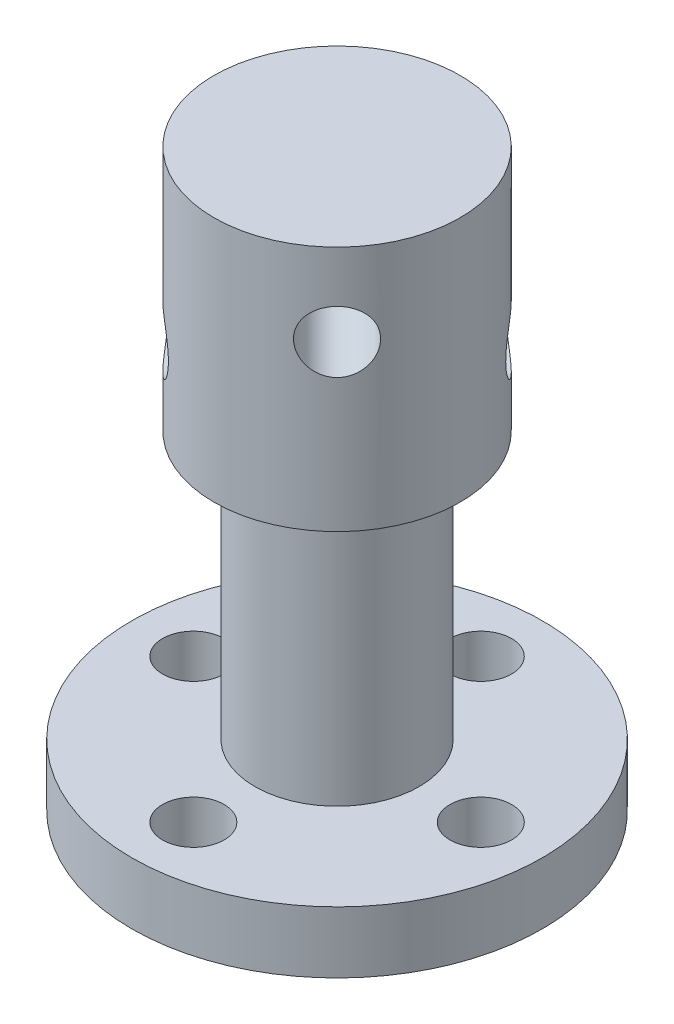
ISO-10303-21;
HEADER;
FILE_DESCRIPTION(('STEP AP214'),'2;1');
FILE_NAME('part.step','',(''),(''),'','','');
FILE_SCHEMA(('AUTOMOTIVE_DESIGN { 1 0 10303 214 1 1 1 1 }'));
ENDSEC;
DATA;
#1=APPLICATION_CONTEXT('core data for automotive mechanical design processes');
#2=APPLICATION_PROTOCOL_DEFINITION('international standard','automotive_design',2000,#1);
#3=PRODUCT_CONTEXT('',#1,'mechanical');
#4=PRODUCT('Part','Part','',(#3));
#5=PRODUCT_RELATED_PRODUCT_CATEGORY('part','',(#4));
#6=PRODUCT_DEFINITION_FORMATION('','',#4);
#7=PRODUCT_DEFINITION_CONTEXT('part definition',#1,'design');
#8=PRODUCT_DEFINITION('design','',#6,#7);
#9=PRODUCT_DEFINITION_SHAPE('','',#8);
#10=(LENGTH_UNIT() NAMED_UNIT(*) SI_UNIT(.MILLI.,.METRE.));
#11=(NAMED_UNIT(*) PLANE_ANGLE_UNIT() SI_UNIT($,.RADIAN.));
#12=(NAMED_UNIT(*) SI_UNIT($,.STERADIAN.) SOLID_ANGLE_UNIT());
#13=UNCERTAINTY_MEASURE_WITH_UNIT(LENGTH_MEASURE(1.E-05),#10,'distance_accuracy_value','');
#14=(GEOMETRIC_REPRESENTATION_CONTEXT(3) GLOBAL_UNCERTAINTY_ASSIGNED_CONTEXT((#13)) GLOBAL_UNIT_ASSIGNED_CONTEXT((#10,
#11,#12)) REPRESENTATION_CONTEXT('',''));
#15=CARTESIAN_POINT('',(0.,0.,0.));
#16=DIRECTION('',(0.,0.,1.));
#17=DIRECTION('',(1.,0.,0.));
#18=AXIS2_PLACEMENT_3D('',#15,#16,#17);
#19=CARTESIAN_POINT('',(0.,3.,0.));
#20=DIRECTION('',(0.,1.,0.));
#21=DIRECTION('',(0.,0.,1.));
#22=AXIS2_PLACEMENT_3D('',#19,#20,#21);
#23=PLANE('',#22);
#24=CARTESIAN_POINT('',(0.,3.,0.));
#25=DIRECTION('',(0.,1.,0.));
#26=DIRECTION('',(0.,0.,1.));
#27=AXIS2_PLACEMENT_3D('',#24,#25,#26);
#28=CIRCLE('',#27,4.);
#29=CARTESIAN_POINT('',(0.,3.,4.));
#30=VERTEX_POINT('',#29);
#31=EDGE_CURVE('E129',#30,#30,#28,.F.);
#32=ORIENTED_EDGE('',*,*,#31,.T.);
#33=EDGE_LOOP('',(#32));
#34=FACE_BOUND('',#33,.T.);
#35=CARTESIAN_POINT('',(3.95332173747447E-13,3.,7.));
#36=DIRECTION('',(0.,1.,0.));
#37=DIRECTION('',(0.,0.,1.));
#38=AXIS2_PLACEMENT_3D('',#35,#36,#37);
#39=CIRCLE('',#38,1.50000000000042);
#40=CARTESIAN_POINT('',(3.95332173747447E-13,3.,8.50000000000043));
#41=VERTEX_POINT('',#40);
#42=EDGE_CURVE('E147',#41,#41,#39,.T.);
#43=ORIENTED_EDGE('',*,*,#42,.F.);
#44=EDGE_LOOP('',(#43));
#45=FACE_BOUND('',#44,.T.);
#46=CARTESIAN_POINT('',(0.,3.,-7.));
#47=DIRECTION('',(0.,1.,0.));
#48=DIRECTION('',(0.,0.,1.));
#49=AXIS2_PLACEMENT_3D('',#46,#47,#48);
#50=CIRCLE('',#49,1.5);
#51=CARTESIAN_POINT('',(0.,3.,-5.5));
#52=VERTEX_POINT('',#51);
#53=EDGE_CURVE('E55',#52,#52,#50,.T.);
#54=ORIENTED_EDGE('',*,*,#53,.F.);
#55=EDGE_LOOP('',(#54));
#56=FACE_BOUND('',#55,.T.);
#57=CARTESIAN_POINT('',(0.,3.,0.));
#58=DIRECTION('',(0.,1.,0.));
#59=DIRECTION('',(0.,0.,1.));
#60=AXIS2_PLACEMENT_3D('',#57,#58,#59);
#61=CIRCLE('',#60,10.);
#62=CARTESIAN_POINT('',(0.,3.,10.));
#63=VERTEX_POINT('',#62);
#64=EDGE_CURVE('E10',#63,#63,#61,.T.);
#65=ORIENTED_EDGE('',*,*,#64,.T.);
#66=EDGE_LOOP('',(#65));
#67=FACE_BOUND('',#66,.T.);
#68=CARTESIAN_POINT('',(7.0000000000002,3.,-1.97666086873723E-13));
#69=DIRECTION('',(0.,1.,0.));
#70=DIRECTION('',(0.,0.,1.));
#71=AXIS2_PLACEMENT_3D('',#68,#69,#70);
#72=CIRCLE('',#71,1.50000000000015);
#73=CARTESIAN_POINT('',(7.0000000000002,3.,1.49999999999996));
#74=VERTEX_POINT('',#73);
#75=EDGE_CURVE('E153',#74,#74,#72,.T.);
#76=ORIENTED_EDGE('',*,*,#75,.F.);
#77=EDGE_LOOP('',(#76));
#78=FACE_BOUND('',#77,.T.);
#79=CARTESIAN_POINT('',(-6.9999999999998,3.,1.98523339633126E-13));
#80=DIRECTION('',(0.,1.,0.));
#81=DIRECTION('',(0.,0.,1.));
#82=AXIS2_PLACEMENT_3D('',#79,#80,#81);
#83=CIRCLE('',#82,1.50000000000032);
#84=CARTESIAN_POINT('',(-6.9999999999998,3.,1.50000000000052));
#85=VERTEX_POINT('',#84);
#86=EDGE_CURVE('E141',#85,#85,#83,.T.);
#87=ORIENTED_EDGE('',*,*,#86,.F.);
#88=EDGE_LOOP('',(#87));
#89=FACE_BOUND('',#88,.T.);
#90=ADVANCED_FACE('F37',(#34,#45,#56,#67,#78,#89),#23,.T.);
#91=CARTESIAN_POINT('',(0.,0.,0.));
#92=DIRECTION('',(0.,1.,0.));
#93=DIRECTION('',(0.,0.,1.));
#94=AXIS2_PLACEMENT_3D('',#91,#92,#93);
#95=PLANE('',#94);
#96=CARTESIAN_POINT('',(0.,0.,0.));
#97=DIRECTION('',(0.,1.,0.));
#98=DIRECTION('',(0.,0.,1.));
#99=AXIS2_PLACEMENT_3D('',#96,#97,#98);
#100=CIRCLE('',#99,10.);
#101=CARTESIAN_POINT('',(0.,0.,10.));
#102=VERTEX_POINT('',#101);
#103=EDGE_CURVE('E50',#102,#102,#100,.T.);
#104=ORIENTED_EDGE('',*,*,#103,.F.);
#105=EDGE_LOOP('',(#104));
#106=FACE_BOUND('',#105,.T.);
#107=CARTESIAN_POINT('',(0.,0.,-7.));
#108=DIRECTION('',(0.,1.,0.));
#109=DIRECTION('',(0.,0.,1.));
#110=AXIS2_PLACEMENT_3D('',#107,#108,#109);
#111=CIRCLE('',#110,1.5);
#112=CARTESIAN_POINT('',(0.,0.,-5.5));
#113=VERTEX_POINT('',#112);
#114=EDGE_CURVE('E58',#113,#113,#111,.T.);
#115=ORIENTED_EDGE('',*,*,#114,.T.);
#116=EDGE_LOOP('',(#115));
#117=FACE_BOUND('',#116,.T.);
#118=CARTESIAN_POINT('',(7.0000000000002,0.,-1.97666086873723E-13));
#119=DIRECTION('',(0.,1.,0.));
#120=DIRECTION('',(0.,0.,1.));
#121=AXIS2_PLACEMENT_3D('',#118,#119,#120);
#122=CIRCLE('',#121,1.50000000000015);
#123=CARTESIAN_POINT('',(7.0000000000002,0.,1.49999999999996));
#124=VERTEX_POINT('',#123);
#125=EDGE_CURVE('E150',#124,#124,#122,.T.);
#126=ORIENTED_EDGE('',*,*,#125,.T.);
#127=EDGE_LOOP('',(#126));
#128=FACE_BOUND('',#127,.T.);
#129=CARTESIAN_POINT('',(3.95332173747447E-13,0.,7.));
#130=DIRECTION('',(0.,1.,0.));
#131=DIRECTION('',(0.,0.,1.));
#132=AXIS2_PLACEMENT_3D('',#129,#130,#131);
#133=CIRCLE('',#132,1.50000000000042);
#134=CARTESIAN_POINT('',(3.95332173747447E-13,0.,8.50000000000043));
#135=VERTEX_POINT('',#134);
#136=EDGE_CURVE('E144',#135,#135,#133,.T.);
#137=ORIENTED_EDGE('',*,*,#136,.T.);
#138=EDGE_LOOP('',(#137));
#139=FACE_BOUND('',#138,.T.);
#140=CARTESIAN_POINT('',(-6.9999999999998,0.,1.98523339633126E-13));
#141=DIRECTION('',(0.,1.,0.));
#142=DIRECTION('',(0.,0.,1.));
#143=AXIS2_PLACEMENT_3D('',#140,#141,#142);
#144=CIRCLE('',#143,1.50000000000032);
#145=CARTESIAN_POINT('',(-6.9999999999998,0.,1.50000000000052));
#146=VERTEX_POINT('',#145);
#147=EDGE_CURVE('E134',#146,#146,#144,.T.);
#148=ORIENTED_EDGE('',*,*,#147,.T.);
#149=EDGE_LOOP('',(#148));
#150=FACE_BOUND('',#149,.T.);
#151=ADVANCED_FACE('F95',(#106,#117,#128,#139,#150),#95,.F.);
#152=CARTESIAN_POINT('',(0.,3.,0.));
#153=DIRECTION('',(0.,-1.,0.));
#154=DIRECTION('',(0.,0.,-1.));
#155=AXIS2_PLACEMENT_3D('',#152,#153,#154);
#156=CYLINDRICAL_SURFACE('',#155,10.);
#157=ORIENTED_EDGE('',*,*,#64,.F.);
#158=EDGE_LOOP('',(#157));
#159=FACE_BOUND('',#158,.T.);
#160=ORIENTED_EDGE('',*,*,#103,.T.);
#161=EDGE_LOOP('',(#160));
#162=FACE_BOUND('',#161,.T.);
#163=ADVANCED_FACE('F39',(#159,#162),#156,.T.);
#164=CARTESIAN_POINT('',(0.,3.,-7.));
#165=DIRECTION('',(0.,-1.,0.));
#166=DIRECTION('',(0.,0.,-1.));
#167=AXIS2_PLACEMENT_3D('',#164,#165,#166);
#168=CYLINDRICAL_SURFACE('',#167,1.5);
#169=ORIENTED_EDGE('',*,*,#53,.T.);
#170=EDGE_LOOP('',(#169));
#171=FACE_BOUND('',#170,.T.);
#172=ORIENTED_EDGE('',*,*,#114,.F.);
#173=EDGE_LOOP('',(#172));
#174=FACE_BOUND('',#173,.T.);
#175=ADVANCED_FACE('F105',(#171,#174),#168,.F.);
#176=CARTESIAN_POINT('',(7.0000000000002,3.,-1.97666086873723E-13));
#177=DIRECTION('',(0.,-1.,0.));
#178=DIRECTION('',(0.,0.,-1.));
#179=AXIS2_PLACEMENT_3D('',#176,#177,#178);
#180=CYLINDRICAL_SURFACE('',#179,1.50000000000015);
#181=ORIENTED_EDGE('',*,*,#75,.T.);
#182=EDGE_LOOP('',(#181));
#183=FACE_BOUND('',#182,.T.);
#184=ORIENTED_EDGE('',*,*,#125,.F.);
#185=EDGE_LOOP('',(#184));
#186=FACE_BOUND('',#185,.T.);
#187=ADVANCED_FACE('F108',(#183,#186),#180,.F.);
#188=CARTESIAN_POINT('',(3.95332173747447E-13,3.,7.));
#189=DIRECTION('',(0.,-1.,0.));
#190=DIRECTION('',(0.,0.,-1.));
#191=AXIS2_PLACEMENT_3D('',#188,#189,#190);
#192=CYLINDRICAL_SURFACE('',#191,1.50000000000042);
#193=ORIENTED_EDGE('',*,*,#42,.T.);
#194=EDGE_LOOP('',(#193));
#195=FACE_BOUND('',#194,.T.);
#196=ORIENTED_EDGE('',*,*,#136,.F.);
#197=EDGE_LOOP('',(#196));
#198=FACE_BOUND('',#197,.T.);
#199=ADVANCED_FACE('F112',(#195,#198),#192,.F.);
#200=CARTESIAN_POINT('',(-6.9999999999998,3.,1.98523339633126E-13));
#201=DIRECTION('',(0.,-1.,0.));
#202=DIRECTION('',(0.,0.,-1.));
#203=AXIS2_PLACEMENT_3D('',#200,#201,#202);
#204=CYLINDRICAL_SURFACE('',#203,1.50000000000032);
#205=ORIENTED_EDGE('',*,*,#86,.T.);
#206=EDGE_LOOP('',(#205));
#207=FACE_BOUND('',#206,.T.);
#208=ORIENTED_EDGE('',*,*,#147,.F.);
#209=EDGE_LOOP('',(#208));
#210=FACE_BOUND('',#209,.T.);
#211=ADVANCED_FACE('F116',(#207,#210),#204,.F.);
#212=CARTESIAN_POINT('',(0.,16.,0.));
#213=DIRECTION('',(0.,-1.,0.));
#214=DIRECTION('',(0.,0.,-1.));
#215=AXIS2_PLACEMENT_3D('',#212,#213,#214);
#216=CYLINDRICAL_SURFACE('',#215,4.);
#217=ORIENTED_EDGE('',*,*,#31,.F.);
#218=EDGE_LOOP('',(#217));
#219=FACE_BOUND('',#218,.T.);
#220=CARTESIAN_POINT('',(0.,16.,0.));
#221=DIRECTION('',(0.,1.,0.));
#222=DIRECTION('',(0.,0.,1.));
#223=AXIS2_PLACEMENT_3D('',#220,#221,#222);
#224=CIRCLE('',#223,4.);
#225=CARTESIAN_POINT('',(0.,16.,4.));
#226=VERTEX_POINT('',#225);
#227=EDGE_CURVE('E131',#226,#226,#224,.T.);
#228=ORIENTED_EDGE('',*,*,#227,.F.);
#229=EDGE_LOOP('',(#228));
#230=FACE_BOUND('',#229,.T.);
#231=ADVANCED_FACE('F119',(#219,#230),#216,.T.);
#232=CARTESIAN_POINT('',(0.,28.,0.));
#233=DIRECTION('',(0.,-1.,0.));
#234=DIRECTION('',(0.,0.,-1.));
#235=AXIS2_PLACEMENT_3D('',#232,#233,#234);
#236=CYLINDRICAL_SURFACE('',#235,6.);
#237=CARTESIAN_POINT('',(3.04725900950897,24.,5.16857935306854));
#238=CARTESIAN_POINT('',(3.04726179129933,24.0828304505548,5.16857880743369));
#239=CARTESIAN_POINT('',(3.05339320996128,24.1656869392068,5.16497774998342));
#240=CARTESIAN_POINT('',(3.07760964290118,24.3290205469044,5.15058350523461));
#241=CARTESIAN_POINT('',(3.09570161407534,24.409496252681,5.13978613214468));
#242=CARTESIAN_POINT('',(3.14290411721005,24.5656821229122,5.11105766460471));
#243=CARTESIAN_POINT('',(3.17200042396876,24.6413982932314,5.09313577842416));
#244=CARTESIAN_POINT('',(3.23987592066896,24.786186511524,5.05022864081786));
#245=CARTESIAN_POINT('',(3.27865552169794,24.8552582772481,5.02524308951048));
#246=CARTESIAN_POINT('',(3.36513477763629,24.9863169871573,4.9677570215999));
#247=CARTESIAN_POINT('',(3.41299615668828,25.04813616021,4.93511722985393));
#248=CARTESIAN_POINT('',(3.51521732424168,25.1614568366162,4.86283449298292));
#249=CARTESIAN_POINT('',(3.56957771952014,25.212957375373,4.82319089378593));
#250=CARTESIAN_POINT('',(3.68357050948847,25.3048652805788,4.73671713523249));
#251=CARTESIAN_POINT('',(3.7432658825612,25.3451078328969,4.68979441760639));
#252=CARTESIAN_POINT('',(3.86506473025767,25.4122857864919,4.58993107889531));
#253=CARTESIAN_POINT('',(3.92716784812289,25.4392231511493,4.5369913471304));
#254=CARTESIAN_POINT('',(4.05031704562701,25.4784887007472,4.42736795554058));
#255=CARTESIAN_POINT('',(4.11135905215045,25.491101786596,4.37078186721879));
#256=CARTESIAN_POINT('',(4.23165526926786,25.5022550275653,4.2544202773061));
#257=CARTESIAN_POINT('',(4.29090974288238,25.5007972633258,4.19464524855994));
#258=CARTESIAN_POINT('',(4.40460840301042,25.4840550898499,4.07505652066586));
#259=CARTESIAN_POINT('',(4.45913015207191,25.4690782049677,4.01527311130786));
#260=CARTESIAN_POINT('',(4.5634920792586,25.4262172379709,3.89625569619227));
#261=CARTESIAN_POINT('',(4.61333200800201,25.3983324687736,3.83702171985207));
#262=CARTESIAN_POINT('',(4.70780035674815,25.3301984575878,3.72052364858066));
#263=CARTESIAN_POINT('',(4.75237761936201,25.2898397732029,3.66328218831899));
#264=CARTESIAN_POINT('',(4.83516283417221,25.1979865925302,3.5533006633841));
#265=CARTESIAN_POINT('',(4.87336967620242,25.1464901588636,3.50056138408082));
#266=CARTESIAN_POINT('',(4.94397983534542,25.0321747548106,3.40013796920514));
#267=CARTESIAN_POINT('',(4.97619809554036,24.9690870645913,3.35262928081848));
#268=CARTESIAN_POINT('',(5.03329554632493,24.8342400158758,3.26628581428992));
#269=CARTESIAN_POINT('',(5.05817439390226,24.7624802523054,3.22745144156848));
#270=CARTESIAN_POINT('',(5.10057700367381,24.6118259795106,3.16001833553124));
#271=CARTESIAN_POINT('',(5.11806451683609,24.5328985618121,3.13147014689015));
#272=CARTESIAN_POINT('',(5.14543239111899,24.3704487191541,3.08629723686222));
#273=CARTESIAN_POINT('',(5.15531438013977,24.2869272816101,3.06966996395316));
#274=CARTESIAN_POINT('',(5.16727467043348,24.1200242990861,3.04949299580959));
#275=CARTESIAN_POINT('',(5.16955219029711,24.0366973240022,3.04560949265861));
#276=CARTESIAN_POINT('',(5.1668534722112,23.8705068380531,3.05018561647681));
#277=CARTESIAN_POINT('',(5.16187790199614,23.7876432852293,3.05864410721659));
#278=CARTESIAN_POINT('',(5.14483665245072,23.6261314410272,3.08721916514394));
#279=CARTESIAN_POINT('',(5.13288831016053,23.5474363640575,3.10714272394871));
#280=CARTESIAN_POINT('',(5.10204070347095,23.394941125289,3.15753828094408));
#281=CARTESIAN_POINT('',(5.08314061566237,23.3211415445668,3.18801152868216));
#282=CARTESIAN_POINT('',(5.03802212967456,23.1789352332796,3.25885322020531));
#283=CARTESIAN_POINT('',(5.01166744013408,23.1106626959741,3.29940405288478));
#284=CARTESIAN_POINT('',(4.95193450562064,22.9828869823192,3.38839351178868));
#285=CARTESIAN_POINT('',(4.91855510627888,22.92338525001,3.43683343412905));
#286=CARTESIAN_POINT('',(4.84409051216514,22.8133133744574,3.54104250584986));
#287=CARTESIAN_POINT('',(4.80283340641343,22.7630039624707,3.59696471517189));
#288=CARTESIAN_POINT('',(4.71367090592631,22.6746384798293,3.71303840901437));
#289=CARTESIAN_POINT('',(4.66576585815504,22.6365817700351,3.77318967273456));
#290=CARTESIAN_POINT('',(4.56448599332806,22.5741323792832,3.89508596041873));
#291=CARTESIAN_POINT('',(4.51115391721384,22.5496414293726,3.9568160407136));
#292=CARTESIAN_POINT('',(4.39992697454517,22.514723799235,4.08013844119406));
#293=CARTESIAN_POINT('',(4.34203299084356,22.5042944047566,4.14173078567413));
#294=CARTESIAN_POINT('',(4.22488329233753,22.4979486156367,4.26112292452143));
#295=CARTESIAN_POINT('',(4.16570672173834,22.5016474363569,4.31898023478135));
#296=CARTESIAN_POINT('',(4.04630343993947,22.5225717409415,4.43104199974446));
#297=CARTESIAN_POINT('',(3.9860767600233,22.5397968225197,4.48524656303238));
#298=CARTESIAN_POINT('',(3.86683106769667,22.5870783296564,4.5884428058997));
#299=CARTESIAN_POINT('',(3.80780729936731,22.6170651799719,4.63746097753888));
#300=CARTESIAN_POINT('',(3.69257790554333,22.688955868529,4.72972759647336));
#301=CARTESIAN_POINT('',(3.63637263634996,22.7308612090043,4.7729753154374));
#302=CARTESIAN_POINT('',(3.52740631635107,22.8265728509956,4.85408415001805));
#303=CARTESIAN_POINT('',(3.4747600380012,22.8806402143611,4.89179139607905));
#304=CARTESIAN_POINT('',(3.37639047767249,22.9986342779607,4.96020010898103));
#305=CARTESIAN_POINT('',(3.33066895411618,23.0625634741469,4.99089979737339));
#306=CARTESIAN_POINT('',(3.24722462036318,23.199902121302,5.04559945363085));
#307=CARTESIAN_POINT('',(3.2096669467387,23.2734661851189,5.06946374710743));
#308=CARTESIAN_POINT('',(3.14540116619407,23.4270832348841,5.10958872863385));
#309=CARTESIAN_POINT('',(3.11868516637621,23.5071314491601,5.12585494949995));
#310=CARTESIAN_POINT('',(3.08132021512818,23.6558655177401,5.1483825481968));
#311=CARTESIAN_POINT('',(3.06858900563303,23.7238397465758,5.15595373634069));
#312=CARTESIAN_POINT('',(3.05155759691776,23.8612033034999,5.16605215225338));
#313=CARTESIAN_POINT('',(3.04725667851735,23.9305925103676,5.16857981028138));
#314=CARTESIAN_POINT('',(3.04725900950897,24.,5.16857935306854));
#315=B_SPLINE_CURVE_WITH_KNOTS('',3,(#237,#238,#239,#240,#241,#242,#243,#244,#245,#246,#247,
#248,#249,#250,#251,#252,#253,#254,#255,#256,#257,#258,#259,#260,#261,#262,#263,#264,#265,#266,
#267,#268,#269,#270,#271,#272,#273,#274,#275,#276,#277,#278,#279,#280,#281,#282,#283,#284,#285,
#286,#287,#288,#289,#290,#291,#292,#293,#294,#295,#296,#297,#298,#299,#300,#301,#302,#303,#304,
#305,#306,#307,#308,#309,#310,#311,#312,#313,#314),.UNSPECIFIED.,.T.,.F.,(4,2,2,2,2,2,2,2,2,2,2,
2,2,2,2,2,2,2,2,2,2,2,2,2,2,2,2,2,2,2,2,2,2,2,2,2,2,2,4),(0.,0.248236465041684,
0.496617444857199,0.744678436299609,0.992749960532871,1.24574372515785,1.4987611288792,
1.75530897838752,2.01181895908255,2.26313250597208,2.51440889199612,2.76010957613368,
3.00582334034872,3.25375724552667,3.50173431281348,3.75642279943147,4.01112318719881,
4.26705859205042,4.52293920077729,4.7720614485703,5.02116076310281,5.26618443005524,
5.51123712852851,5.76109707515495,6.01099811331027,6.26715198579192,6.52329249431732,
6.77755243684158,7.03176329345423,7.27910067676474,7.52643070426189,7.77242925935827,
8.01845883442843,8.27038257949243,8.52237018939306,8.77905886370807,9.03556032819972,
9.24358696306399,9.45159585059713),.UNSPECIFIED.);
#316=CARTESIAN_POINT('',(3.04725900950897,24.,5.16857935306854));
#317=VERTEX_POINT('',#316);
#318=EDGE_CURVE('E41',#317,#317,#315,.T.);
#319=ORIENTED_EDGE('',*,*,#318,.T.);
#320=EDGE_LOOP('',(#319));
#321=FACE_BOUND('',#320,.T.);
#322=CARTESIAN_POINT('',(-5.1685793530686,24.,-3.04725900950888));
#323=CARTESIAN_POINT('',(-5.16857880743374,23.9171695494452,-3.04726179129924));
#324=CARTESIAN_POINT('',(-5.16497774998347,23.8343130607932,-3.05339320996119));
#325=CARTESIAN_POINT('',(-5.15058350523466,23.6709794530956,-3.07760964290109));
#326=CARTESIAN_POINT('',(-5.13978613214474,23.590503747319,-3.09570161407525));
#327=CARTESIAN_POINT('',(-5.11105766460476,23.4343178770878,-3.14290411720997));
#328=CARTESIAN_POINT('',(-5.09313577842421,23.3586017067686,-3.17200042396868));
#329=CARTESIAN_POINT('',(-5.05022864081791,23.213813488476,-3.23987592066887));
#330=CARTESIAN_POINT('',(-5.02524308951053,23.1447417227519,-3.27865552169785));
#331=CARTESIAN_POINT('',(-4.96775702159996,23.0136830128427,-3.3651347776362));
#332=CARTESIAN_POINT('',(-4.93511722985399,22.95186383979,-3.41299615668819));
#333=CARTESIAN_POINT('',(-4.86283449298298,22.8385431633838,-3.51521732424159));
#334=CARTESIAN_POINT('',(-4.823190893786,22.787042624627,-3.56957771952006));
#335=CARTESIAN_POINT('',(-4.73671713523255,22.6951347194212,-3.68357050948839));
#336=CARTESIAN_POINT('',(-4.68979441760645,22.6548921671031,-3.74326588256112));
#337=CARTESIAN_POINT('',(-4.58993107889537,22.5877142135081,-3.86506473025759));
#338=CARTESIAN_POINT('',(-4.53699134713046,22.5607768488507,-3.92716784812282));
#339=CARTESIAN_POINT('',(-4.42736795554065,22.5215112992529,-4.05031704562693));
#340=CARTESIAN_POINT('',(-4.37078186721887,22.5088982134041,-4.11135905215037));
#341=CARTESIAN_POINT('',(-4.25442027730618,22.4977449724347,-4.23165526926779));
#342=CARTESIAN_POINT('',(-4.19464524856001,22.4992027366742,-4.29090974288231));
#343=CARTESIAN_POINT('',(-4.07505652066593,22.5159449101501,-4.40460840301035));
#344=CARTESIAN_POINT('',(-4.01527311130794,22.5309217950323,-4.45913015207184));
#345=CARTESIAN_POINT('',(-3.89625569619235,22.5737827620291,-4.56349207925853));
#346=CARTESIAN_POINT('',(-3.83702171985215,22.6016675312264,-4.61333200800195));
#347=CARTESIAN_POINT('',(-3.72052364858075,22.6698015424122,-4.70780035674809));
#348=CARTESIAN_POINT('',(-3.66328218831907,22.7101602267971,-4.75237761936195));
#349=CARTESIAN_POINT('',(-3.55330066338418,22.8020134074698,-4.83516283417215));
#350=CARTESIAN_POINT('',(-3.5005613840809,22.8535098411364,-4.87336967620236));
#351=CARTESIAN_POINT('',(-3.40013796920523,22.9678252451894,-4.94397983534536));
#352=CARTESIAN_POINT('',(-3.35262928081857,23.0309129354087,-4.9761980955403));
#353=CARTESIAN_POINT('',(-3.26628581429001,23.1657599841242,-5.03329554632487));
#354=CARTESIAN_POINT('',(-3.22745144156857,23.2375197476946,-5.05817439390221));
#355=CARTESIAN_POINT('',(-3.16001833553133,23.3881740204894,-5.10057700367376));
#356=CARTESIAN_POINT('',(-3.13147014689024,23.4671014381879,-5.11806451683604));
#357=CARTESIAN_POINT('',(-3.08629723686231,23.6295512808459,-5.14543239111893));
#358=CARTESIAN_POINT('',(-3.06966996395324,23.7130727183899,-5.15531438013972));
#359=CARTESIAN_POINT('',(-3.04949299580967,23.8799757009139,-5.16727467043343));
#360=CARTESIAN_POINT('',(-3.0456094926587,23.9633026759978,-5.16955219029705));
#361=CARTESIAN_POINT('',(-3.0501856164769,24.1294931619469,-5.16685347221115));
#362=CARTESIAN_POINT('',(-3.05864410721668,24.2123567147707,-5.16187790199609));
#363=CARTESIAN_POINT('',(-3.08721916514403,24.3738685589728,-5.14483665245067));
#364=CARTESIAN_POINT('',(-3.10714272394879,24.4525636359425,-5.13288831016048));
#365=CARTESIAN_POINT('',(-3.15753828094416,24.605058874711,-5.1020407034709));
#366=CARTESIAN_POINT('',(-3.18801152868225,24.6788584554332,-5.08314061566232));
#367=CARTESIAN_POINT('',(-3.25885322020539,24.8210647667204,-5.03802212967451));
#368=CARTESIAN_POINT('',(-3.29940405288487,24.8893373040259,-5.01166744013402));
#369=CARTESIAN_POINT('',(-3.38839351178877,25.0171130176808,-4.95193450562058));
#370=CARTESIAN_POINT('',(-3.43683343412914,25.07661474999,-4.91855510627881));
#371=CARTESIAN_POINT('',(-3.54104250584995,25.1866866255426,-4.84409051216507));
#372=CARTESIAN_POINT('',(-3.59696471517198,25.2369960375293,-4.80283340641337));
#373=CARTESIAN_POINT('',(-3.71303840901445,25.3253615201707,-4.71367090592625));
#374=CARTESIAN_POINT('',(-3.77318967273464,25.3634182299649,-4.66576585815497));
#375=CARTESIAN_POINT('',(-3.8950859604188,25.4258676207168,-4.56448599332799));
#376=CARTESIAN_POINT('',(-3.95681604071368,25.4503585706274,-4.51115391721377));
#377=CARTESIAN_POINT('',(-4.08013844119414,25.4852762007651,-4.3999269745451));
#378=CARTESIAN_POINT('',(-4.14173078567421,25.4957055952434,-4.34203299084349));
#379=CARTESIAN_POINT('',(-4.2611229245215,25.5020513843633,-4.22488329233746));
#380=CARTESIAN_POINT('',(-4.31898023478142,25.4983525636431,-4.16570672173827));
#381=CARTESIAN_POINT('',(-4.43104199974453,25.4774282590585,-4.04630343993939));
#382=CARTESIAN_POINT('',(-4.48524656303245,25.4602031774803,-3.98607676002322));
#383=CARTESIAN_POINT('',(-4.58844280589977,25.4129216703436,-3.86683106769659));
#384=CARTESIAN_POINT('',(-4.63746097753894,25.3829348200281,-3.80780729936723));
#385=CARTESIAN_POINT('',(-4.72972759647342,25.311044131471,-3.69257790554325));
#386=CARTESIAN_POINT('',(-4.77297531543747,25.2691387909957,-3.63637263634988));
#387=CARTESIAN_POINT('',(-4.85408415001811,25.1734271490044,-3.52740631635099));
#388=CARTESIAN_POINT('',(-4.8917913960791,25.1193597856389,-3.47476003800112));
#389=CARTESIAN_POINT('',(-4.96020010898108,25.0013657220393,-3.37639047767241));
#390=CARTESIAN_POINT('',(-4.99089979737345,24.9374365258531,-3.3306689541161));
#391=CARTESIAN_POINT('',(-5.04559945363091,24.800097878698,-3.2472246203631));
#392=CARTESIAN_POINT('',(-5.06946374710748,24.7265338148811,-3.20966694673861));
#393=CARTESIAN_POINT('',(-5.10958872863391,24.5729167651159,-3.14540116619398));
#394=CARTESIAN_POINT('',(-5.1258549495,24.4928685508399,-3.11868516637612));
#395=CARTESIAN_POINT('',(-5.14838254819685,24.3441344822599,-3.08132021512809));
#396=CARTESIAN_POINT('',(-5.15595373634074,24.2761602534242,-3.06858900563294));
#397=CARTESIAN_POINT('',(-5.16605215225343,24.1387966965001,-3.05155759691767));
#398=CARTESIAN_POINT('',(-5.16857981028144,24.0694074896324,-3.04725667851727));
#399=CARTESIAN_POINT('',(-5.1685793530686,24.,-3.04725900950888));
#400=B_SPLINE_CURVE_WITH_KNOTS('',3,(#322,#323,#324,#325,#326,#327,#328,#329,#330,#331,#332,
#333,#334,#335,#336,#337,#338,#339,#340,#341,#342,#343,#344,#345,#346,#347,#348,#349,#350,#351,
#352,#353,#354,#355,#356,#357,#358,#359,#360,#361,#362,#363,#364,#365,#366,#367,#368,#369,#370,
#371,#372,#373,#374,#375,#376,#377,#378,#379,#380,#381,#382,#383,#384,#385,#386,#387,#388,#389,
#390,#391,#392,#393,#394,#395,#396,#397,#398,#399),.UNSPECIFIED.,.T.,.F.,(4,2,2,2,2,2,2,2,2,2,2,
2,2,2,2,2,2,2,2,2,2,2,2,2,2,2,2,2,2,2,2,2,2,2,2,2,2,2,4),(0.,0.248236465041684,
0.496617444857199,0.744678436299612,0.992749960532871,1.24574372515786,1.4987611288792,
1.75530897838752,2.01181895908255,2.26313250597208,2.51440889199612,2.76010957613368,
3.00582334034872,3.25375724552667,3.50173431281348,3.75642279943147,4.01112318719881,
4.26705859205042,4.52293920077729,4.77206144857031,5.02116076310281,5.26618443005524,
5.51123712852851,5.76109707515495,6.01099811331027,6.26715198579192,6.52329249431732,
6.77755243684158,7.03176329345423,7.27910067676474,7.52643070426189,7.77242925935827,
8.01845883442844,8.27038257949242,8.52237018939306,8.77905886370807,9.03556032819972,
9.24358696306399,9.45159585059713),.UNSPECIFIED.);
#401=CARTESIAN_POINT('',(-5.1685793530686,24.,-3.04725900950888));
#402=VERTEX_POINT('',#401);
#403=EDGE_CURVE('E196',#402,#402,#400,.T.);
#404=ORIENTED_EDGE('',*,*,#403,.T.);
#405=EDGE_LOOP('',(#404));
#406=FACE_BOUND('',#405,.T.);
#407=CARTESIAN_POINT('',(-5.16857935306855,20.,3.04725900950895));
#408=CARTESIAN_POINT('',(-5.1685788074337,20.0828304505548,3.04726179129931));
#409=CARTESIAN_POINT('',(-5.16497774998343,20.1656869392068,3.05339320996126));
#410=CARTESIAN_POINT('',(-5.15058350523462,20.3290205469044,3.07760964290116));
#411=CARTESIAN_POINT('',(-5.13978613214469,20.409496252681,3.09570161407532));
#412=CARTESIAN_POINT('',(-5.11105766460472,20.5656821229122,3.14290411721004));
#413=CARTESIAN_POINT('',(-5.09313577842417,20.6413982932314,3.17200042396875));
#414=CARTESIAN_POINT('',(-5.05022864081787,20.786186511524,3.23987592066895));
#415=CARTESIAN_POINT('',(-5.02524308951049,20.8552582772481,3.27865552169792));
#416=CARTESIAN_POINT('',(-4.96775702159991,20.9863169871573,3.36513477763627));
#417=CARTESIAN_POINT('',(-4.93511722985394,21.04813616021,3.41299615668826));
#418=CARTESIAN_POINT('',(-4.86283449298293,21.1614568366162,3.51521732424166));
#419=CARTESIAN_POINT('',(-4.82319089378595,21.2129573753731,3.56957771952013));
#420=CARTESIAN_POINT('',(-4.7367171352325,21.3048652805788,3.68357050948846));
#421=CARTESIAN_POINT('',(-4.6897944176064,21.3451078328969,3.74326588256118));
#422=CARTESIAN_POINT('',(-4.58993107889532,21.4122857864919,3.86506473025765));
#423=CARTESIAN_POINT('',(-4.53699134713041,21.4392231511493,3.92716784812288));
#424=CARTESIAN_POINT('',(-4.42736795554059,21.4784887007472,4.05031704562699));
#425=CARTESIAN_POINT('',(-4.37078186721881,21.491101786596,4.11135905215043));
#426=CARTESIAN_POINT('',(-4.25442027730612,21.5022550275653,4.23165526926784));
#427=CARTESIAN_POINT('',(-4.19464524855996,21.5007972633258,4.29090974288237));
#428=CARTESIAN_POINT('',(-4.07505652066587,21.4840550898499,4.40460840301041));
#429=CARTESIAN_POINT('',(-4.01527311130787,21.4690782049677,4.45913015207189));
#430=CARTESIAN_POINT('',(-3.89625569619229,21.4262172379709,4.56349207925858));
#431=CARTESIAN_POINT('',(-3.83702171985208,21.3983324687736,4.613332008002));
#432=CARTESIAN_POINT('',(-3.72052364858068,21.3301984575878,4.70780035674814));
#433=CARTESIAN_POINT('',(-3.66328218831901,21.2898397732029,4.752377619362));
#434=CARTESIAN_POINT('',(-3.55330066338411,21.1979865925302,4.8351628341722));
#435=CARTESIAN_POINT('',(-3.50056138408083,21.1464901588636,4.87336967620241));
#436=CARTESIAN_POINT('',(-3.40013796920516,21.0321747548106,4.94397983534541));
#437=CARTESIAN_POINT('',(-3.35262928081849,20.9690870645913,4.97619809554035));
#438=CARTESIAN_POINT('',(-3.26628581428993,20.8342400158758,5.03329554632491));
#439=CARTESIAN_POINT('',(-3.22745144156849,20.7624802523054,5.05817439390225));
#440=CARTESIAN_POINT('',(-3.16001833553126,20.6118259795106,5.1005770036738));
#441=CARTESIAN_POINT('',(-3.13147014689017,20.5328985618121,5.11806451683608));
#442=CARTESIAN_POINT('',(-3.08629723686224,20.3704487191541,5.14543239111897));
#443=CARTESIAN_POINT('',(-3.06966996395317,20.2869272816101,5.15531438013976));
#444=CARTESIAN_POINT('',(-3.0494929958096,20.1200242990861,5.16727467043347));
#445=CARTESIAN_POINT('',(-3.04560949265863,20.0366973240022,5.16955219029709));
#446=CARTESIAN_POINT('',(-3.05018561647683,19.8705068380531,5.16685347221119));
#447=CARTESIAN_POINT('',(-3.05864410721661,19.7876432852293,5.16187790199613));
#448=CARTESIAN_POINT('',(-3.08721916514396,19.6261314410272,5.14483665245071));
#449=CARTESIAN_POINT('',(-3.10714272394872,19.5474363640575,5.13288831016052));
#450=CARTESIAN_POINT('',(-3.15753828094409,19.394941125289,5.10204070347094));
#451=CARTESIAN_POINT('',(-3.18801152868217,19.3211415445668,5.08314061566236));
#452=CARTESIAN_POINT('',(-3.25885322020532,19.1789352332796,5.03802212967455));
#453=CARTESIAN_POINT('',(-3.2994040528848,19.1106626959741,5.01166744013407));
#454=CARTESIAN_POINT('',(-3.3883935117887,18.9828869823192,4.95193450562063));
#455=CARTESIAN_POINT('',(-3.43683343412907,18.92338525001,4.91855510627886));
#456=CARTESIAN_POINT('',(-3.54104250584988,18.8133133744574,4.84409051216513));
#457=CARTESIAN_POINT('',(-3.59696471517191,18.7630039624707,4.80283340641342));
#458=CARTESIAN_POINT('',(-3.71303840901438,18.6746384798293,4.7136709059263));
#459=CARTESIAN_POINT('',(-3.77318967273458,18.6365817700351,4.66576585815502));
#460=CARTESIAN_POINT('',(-3.89508596041874,18.5741323792832,4.56448599332805));
#461=CARTESIAN_POINT('',(-3.95681604071361,18.5496414293726,4.51115391721383));
#462=CARTESIAN_POINT('',(-4.08013844119408,18.514723799235,4.39992697454515));
#463=CARTESIAN_POINT('',(-4.14173078567415,18.5042944047566,4.34203299084354));
#464=CARTESIAN_POINT('',(-4.26112292452144,18.4979486156367,4.22488329233752));
#465=CARTESIAN_POINT('',(-4.31898023478137,18.5016474363569,4.16570672173833));
#466=CARTESIAN_POINT('',(-4.43104199974447,18.5225717409415,4.04630343993945));
#467=CARTESIAN_POINT('',(-4.4852465630324,18.5397968225197,3.98607676002328));
#468=CARTESIAN_POINT('',(-4.58844280589971,18.5870783296564,3.86683106769666));
#469=CARTESIAN_POINT('',(-4.63746097753889,18.6170651799719,3.8078072993673));
#470=CARTESIAN_POINT('',(-4.72972759647337,18.688955868529,3.69257790554332));
#471=CARTESIAN_POINT('',(-4.77297531543741,18.7308612090043,3.63637263634995));
#472=CARTESIAN_POINT('',(-4.85408415001806,18.8265728509956,3.52740631635106));
#473=CARTESIAN_POINT('',(-4.89179139607906,18.8806402143611,3.47476003800119));
#474=CARTESIAN_POINT('',(-4.96020010898104,18.9986342779607,3.37639047767247));
#475=CARTESIAN_POINT('',(-4.9908997973734,19.0625634741469,3.33066895411616));
#476=CARTESIAN_POINT('',(-5.04559945363086,19.199902121302,3.24722462036317));
#477=CARTESIAN_POINT('',(-5.06946374710744,19.2734661851189,3.20966694673868));
#478=CARTESIAN_POINT('',(-5.10958872863386,19.4270832348841,3.14540116619405));
#479=CARTESIAN_POINT('',(-5.12585494949996,19.5071314491601,3.11868516637619));
#480=CARTESIAN_POINT('',(-5.14838254819681,19.6558655177401,3.08132021512816));
#481=CARTESIAN_POINT('',(-5.1559537363407,19.7238397465758,3.06858900563301));
#482=CARTESIAN_POINT('',(-5.16605215225339,19.8612033034999,3.05155759691774));
#483=CARTESIAN_POINT('',(-5.16857981028139,19.9305925103676,3.04725667851734));
#484=CARTESIAN_POINT('',(-5.16857935306855,20.,3.04725900950895));
#485=B_SPLINE_CURVE_WITH_KNOTS('',3,(#407,#408,#409,#410,#411,#412,#413,#414,#415,#416,#417,
#418,#419,#420,#421,#422,#423,#424,#425,#426,#427,#428,#429,#430,#431,#432,#433,#434,#435,#436,
#437,#438,#439,#440,#441,#442,#443,#444,#445,#446,#447,#448,#449,#450,#451,#452,#453,#454,#455,
#456,#457,#458,#459,#460,#461,#462,#463,#464,#465,#466,#467,#468,#469,#470,#471,#472,#473,#474,
#475,#476,#477,#478,#479,#480,#481,#482,#483,#484),.UNSPECIFIED.,.T.,.F.,(4,2,2,2,2,2,2,2,2,2,2,
2,2,2,2,2,2,2,2,2,2,2,2,2,2,2,2,2,2,2,2,2,2,2,2,2,2,2,4),(0.,0.248236465041681,
0.496617444857199,0.744678436299613,0.992749960532871,1.24574372515786,1.4987611288792,
1.75530897838752,2.01181895908255,2.26313250597208,2.51440889199612,2.76010957613368,
3.00582334034872,3.25375724552667,3.50173431281348,3.75642279943147,4.01112318719881,
4.26705859205041,4.52293920077729,4.7720614485703,5.02116076310281,5.26618443005524,
5.51123712852851,5.76109707515494,6.01099811331027,6.26715198579191,6.52329249431732,
6.77755243684158,7.03176329345423,7.27910067676474,7.52643070426189,7.77242925935827,
8.01845883442843,8.27038257949243,8.52237018939305,8.77905886370806,9.03556032819972,
9.24358696306398,9.45159585059713),.UNSPECIFIED.);
#486=CARTESIAN_POINT('',(-5.16857935306855,20.,3.04725900950895));
#487=VERTEX_POINT('',#486);
#488=EDGE_CURVE('E68',#487,#487,#485,.T.);
#489=ORIENTED_EDGE('',*,*,#488,.T.);
#490=EDGE_LOOP('',(#489));
#491=FACE_BOUND('',#490,.T.);
#492=CARTESIAN_POINT('',(3.0472590095089,20.,-5.16857935306858));
#493=CARTESIAN_POINT('',(3.04726179129926,19.9171695494452,-5.16857880743373));
#494=CARTESIAN_POINT('',(3.05339320996121,19.8343130607932,-5.16497774998346));
#495=CARTESIAN_POINT('',(3.07760964290111,19.6709794530956,-5.15058350523465));
#496=CARTESIAN_POINT('',(3.09570161407527,19.590503747319,-5.13978613214473));
#497=CARTESIAN_POINT('',(3.14290411720998,19.4343178770878,-5.11105766460475));
#498=CARTESIAN_POINT('',(3.17200042396869,19.3586017067686,-5.0931357784242));
#499=CARTESIAN_POINT('',(3.23987592066889,19.213813488476,-5.0502286408179));
#500=CARTESIAN_POINT('',(3.27865552169787,19.1447417227519,-5.02524308951052));
#501=CARTESIAN_POINT('',(3.36513477763622,19.0136830128427,-4.96775702159995));
#502=CARTESIAN_POINT('',(3.41299615668821,18.95186383979,-4.93511722985398));
#503=CARTESIAN_POINT('',(3.51521732424161,18.8385431633838,-4.86283449298297));
#504=CARTESIAN_POINT('',(3.56957771952008,18.787042624627,-4.82319089378598));
#505=CARTESIAN_POINT('',(3.68357050948841,18.6951347194212,-4.73671713523254));
#506=CARTESIAN_POINT('',(3.74326588256113,18.6548921671031,-4.68979441760644));
#507=CARTESIAN_POINT('',(3.86506473025761,18.5877142135081,-4.58993107889536));
#508=CARTESIAN_POINT('',(3.92716784812283,18.5607768488507,-4.53699134713045));
#509=CARTESIAN_POINT('',(4.05031704562695,18.5215112992529,-4.42736795554064));
#510=CARTESIAN_POINT('',(4.11135905215039,18.5088982134041,-4.37078186721885));
#511=CARTESIAN_POINT('',(4.2316552692678,18.4977449724347,-4.25442027730616));
#512=CARTESIAN_POINT('',(4.29090974288232,18.4992027366742,-4.19464524856));
#513=CARTESIAN_POINT('',(4.40460840301037,18.5159449101501,-4.07505652066592));
#514=CARTESIAN_POINT('',(4.45913015207185,18.5309217950323,-4.01527311130792));
#515=CARTESIAN_POINT('',(4.56349207925854,18.5737827620291,-3.89625569619234));
#516=CARTESIAN_POINT('',(4.61333200800196,18.6016675312264,-3.83702171985213));
#517=CARTESIAN_POINT('',(4.7078003567481,18.6698015424122,-3.72052364858073));
#518=CARTESIAN_POINT('',(4.75237761936196,18.7101602267971,-3.66328218831906));
#519=CARTESIAN_POINT('',(4.83516283417216,18.8020134074698,-3.55330066338416));
#520=CARTESIAN_POINT('',(4.87336967620237,18.8535098411364,-3.50056138408088));
#521=CARTESIAN_POINT('',(4.94397983534538,18.9678252451894,-3.40013796920521));
#522=CARTESIAN_POINT('',(4.97619809554032,19.0309129354087,-3.35262928081855));
#523=CARTESIAN_POINT('',(5.03329554632488,19.1657599841242,-3.26628581428999));
#524=CARTESIAN_POINT('',(5.05817439390222,19.2375197476946,-3.22745144156855));
#525=CARTESIAN_POINT('',(5.10057700367377,19.3881740204894,-3.16001833553131));
#526=CARTESIAN_POINT('',(5.11806451683605,19.4671014381879,-3.13147014689023));
#527=CARTESIAN_POINT('',(5.14543239111894,19.6295512808459,-3.0862972368623));
#528=CARTESIAN_POINT('',(5.15531438013973,19.7130727183899,-3.06966996395323));
#529=CARTESIAN_POINT('',(5.16727467043344,19.8799757009139,-3.04949299580966));
#530=CARTESIAN_POINT('',(5.16955219029706,19.9633026759978,-3.04560949265868));
#531=CARTESIAN_POINT('',(5.16685347221116,20.1294931619469,-3.05018561647688));
#532=CARTESIAN_POINT('',(5.16187790199609,20.2123567147707,-3.05864410721667));
#533=CARTESIAN_POINT('',(5.14483665245067,20.3738685589728,-3.08721916514401));
#534=CARTESIAN_POINT('',(5.13288831016049,20.4525636359425,-3.10714272394878));
#535=CARTESIAN_POINT('',(5.10204070347091,20.605058874711,-3.15753828094415));
#536=CARTESIAN_POINT('',(5.08314061566233,20.6788584554332,-3.18801152868223));
#537=CARTESIAN_POINT('',(5.03802212967452,20.8210647667204,-3.25885322020538));
#538=CARTESIAN_POINT('',(5.01166744013404,20.8893373040259,-3.29940405288485));
#539=CARTESIAN_POINT('',(4.9519345056206,21.0171130176808,-3.38839351178875));
#540=CARTESIAN_POINT('',(4.91855510627883,21.07661474999,-3.43683343412912));
#541=CARTESIAN_POINT('',(4.84409051216509,21.1866866255426,-3.54104250584993));
#542=CARTESIAN_POINT('',(4.80283340641338,21.2369960375293,-3.59696471517196));
#543=CARTESIAN_POINT('',(4.71367090592626,21.3253615201707,-3.71303840901443));
#544=CARTESIAN_POINT('',(4.66576585815498,21.3634182299649,-3.77318967273463));
#545=CARTESIAN_POINT('',(4.564485993328,21.4258676207168,-3.89508596041879));
#546=CARTESIAN_POINT('',(4.51115391721379,21.4503585706274,-3.95681604071366));
#547=CARTESIAN_POINT('',(4.39992697454511,21.485276200765,-4.08013844119413));
#548=CARTESIAN_POINT('',(4.3420329908435,21.4957055952434,-4.14173078567419));
#549=CARTESIAN_POINT('',(4.22488329233747,21.5020513843633,-4.26112292452148));
#550=CARTESIAN_POINT('',(4.16570672173828,21.4983525636431,-4.31898023478141));
#551=CARTESIAN_POINT('',(4.0463034399394,21.4774282590585,-4.43104199974452));
#552=CARTESIAN_POINT('',(3.98607676002324,21.4602031774803,-4.48524656303244));
#553=CARTESIAN_POINT('',(3.86683106769661,21.4129216703436,-4.58844280589976));
#554=CARTESIAN_POINT('',(3.80780729936725,21.3829348200281,-4.63746097753893));
#555=CARTESIAN_POINT('',(3.69257790554327,21.311044131471,-4.72972759647341));
#556=CARTESIAN_POINT('',(3.6363726363499,21.2691387909957,-4.77297531543745));
#557=CARTESIAN_POINT('',(3.527406316351,21.1734271490044,-4.8540841500181));
#558=CARTESIAN_POINT('',(3.47476003800114,21.1193597856389,-4.89179139607909));
#559=CARTESIAN_POINT('',(3.37639047767242,21.0013657220393,-4.96020010898107));
#560=CARTESIAN_POINT('',(3.33066895411611,20.9374365258531,-4.99089979737344));
#561=CARTESIAN_POINT('',(3.24722462036311,20.800097878698,-5.04559945363089));
#562=CARTESIAN_POINT('',(3.20966694673863,20.7265338148811,-5.06946374710747));
#563=CARTESIAN_POINT('',(3.145401166194,20.572916765116,-5.1095887286339));
#564=CARTESIAN_POINT('',(3.11868516637614,20.4928685508399,-5.12585494949999));
#565=CARTESIAN_POINT('',(3.08132021512811,20.3441344822599,-5.14838254819684));
#566=CARTESIAN_POINT('',(3.06858900563296,20.2761602534242,-5.15595373634073));
#567=CARTESIAN_POINT('',(3.05155759691769,20.1387966965001,-5.16605215225342));
#568=CARTESIAN_POINT('',(3.04725667851728,20.0694074896324,-5.16857981028142));
#569=CARTESIAN_POINT('',(3.0472590095089,20.,-5.16857935306858));
#570=B_SPLINE_CURVE_WITH_KNOTS('',3,(#492,#493,#494,#495,#496,#497,#498,#499,#500,#501,#502,
#503,#504,#505,#506,#507,#508,#509,#510,#511,#512,#513,#514,#515,#516,#517,#518,#519,#520,#521,
#522,#523,#524,#525,#526,#527,#528,#529,#530,#531,#532,#533,#534,#535,#536,#537,#538,#539,#540,
#541,#542,#543,#544,#545,#546,#547,#548,#549,#550,#551,#552,#553,#554,#555,#556,#557,#558,#559,
#560,#561,#562,#563,#564,#565,#566,#567,#568,#569),.UNSPECIFIED.,.T.,.F.,(4,2,2,2,2,2,2,2,2,2,2,
2,2,2,2,2,2,2,2,2,2,2,2,2,2,2,2,2,2,2,2,2,2,2,2,2,2,2,4),(0.,0.248236465041681,
0.496617444857199,0.744678436299613,0.99274996053287,1.24574372515786,1.4987611288792,
1.75530897838752,2.01181895908255,2.26313250597208,2.51440889199612,2.76010957613368,
3.00582334034871,3.25375724552667,3.50173431281348,3.75642279943147,4.01112318719881,
4.26705859205042,4.52293920077729,4.7720614485703,5.02116076310281,5.26618443005524,
5.51123712852851,5.76109707515495,6.01099811331027,6.26715198579191,6.52329249431732,
6.77755243684158,7.03176329345423,7.27910067676474,7.52643070426189,7.77242925935827,
8.01845883442844,8.27038257949243,8.52237018939305,8.77905886370806,9.03556032819972,
9.24358696306398,9.45159585059713),.UNSPECIFIED.);
#571=CARTESIAN_POINT('',(3.0472590095089,20.,-5.16857935306858));
#572=VERTEX_POINT('',#571);
#573=EDGE_CURVE('E61',#572,#572,#570,.T.);
#574=ORIENTED_EDGE('',*,*,#573,.T.);
#575=EDGE_LOOP('',(#574));
#576=FACE_BOUND('',#575,.T.);
#577=CARTESIAN_POINT('',(0.,28.,0.));
#578=DIRECTION('',(0.,1.,0.));
#579=DIRECTION('',(0.,0.,1.));
#580=AXIS2_PLACEMENT_3D('',#577,#578,#579);
#581=CIRCLE('',#580,6.);
#582=CARTESIAN_POINT('',(0.,28.,6.));
#583=VERTEX_POINT('',#582);
#584=EDGE_CURVE('E132',#583,#583,#581,.T.);
#585=ORIENTED_EDGE('',*,*,#584,.F.);
#586=EDGE_LOOP('',(#585));
#587=FACE_BOUND('',#586,.T.);
#588=CARTESIAN_POINT('',(0.,16.,0.));
#589=DIRECTION('',(0.,1.,0.));
#590=DIRECTION('',(0.,0.,1.));
#591=AXIS2_PLACEMENT_3D('',#588,#589,#590);
#592=CIRCLE('',#591,6.);
#593=CARTESIAN_POINT('',(0.,16.,6.));
#594=VERTEX_POINT('',#593);
#595=EDGE_CURVE('E137',#594,#594,#592,.T.);
#596=ORIENTED_EDGE('',*,*,#595,.T.);
#597=EDGE_LOOP('',(#596));
#598=FACE_BOUND('',#597,.T.);
#599=ADVANCED_FACE('F72',(#321,#406,#491,#576,#587,#598),#236,.T.);
#600=CARTESIAN_POINT('',(0.,28.,0.));
#601=DIRECTION('',(0.,1.,0.));
#602=DIRECTION('',(0.,0.,1.));
#603=AXIS2_PLACEMENT_3D('',#600,#601,#602);
#604=PLANE('',#603);
#605=ORIENTED_EDGE('',*,*,#584,.T.);
#606=EDGE_LOOP('',(#605));
#607=FACE_BOUND('',#606,.T.);
#608=ADVANCED_FACE('F84',(#607),#604,.T.);
#609=CARTESIAN_POINT('',(0.,16.,0.));
#610=DIRECTION('',(0.,1.,0.));
#611=DIRECTION('',(0.,0.,1.));
#612=AXIS2_PLACEMENT_3D('',#609,#610,#611);
#613=PLANE('',#612);
#614=ORIENTED_EDGE('',*,*,#227,.T.);
#615=EDGE_LOOP('',(#614));
#616=FACE_BOUND('',#615,.T.);
#617=ORIENTED_EDGE('',*,*,#595,.F.);
#618=EDGE_LOOP('',(#617));
#619=FACE_BOUND('',#618,.T.);
#620=ADVANCED_FACE('F81',(#616,#619),#613,.F.);
#621=CARTESIAN_POINT('',(-9.99999999999995,20.,10.0000000000001));
#622=DIRECTION('',(0.707106781186544,0.,-0.707106781186551));
#623=DIRECTION('',(-0.707106781186551,0.,-0.707106781186544));
#624=AXIS2_PLACEMENT_3D('',#621,#622,#623);
#625=CYLINDRICAL_SURFACE('',#624,1.5);
#626=ORIENTED_EDGE('',*,*,#573,.F.);
#627=EDGE_LOOP('',(#626));
#628=FACE_BOUND('',#627,.T.);
#629=ORIENTED_EDGE('',*,*,#488,.F.);
#630=EDGE_LOOP('',(#629));
#631=FACE_BOUND('',#630,.T.);
#632=ADVANCED_FACE('F76',(#628,#631),#625,.F.);
#633=CARTESIAN_POINT('',(10.0000000000001,24.,9.99999999999991));
#634=DIRECTION('',(-0.707106781186554,0.,-0.707106781186541));
#635=DIRECTION('',(-0.707106781186541,0.,0.707106781186554));
#636=AXIS2_PLACEMENT_3D('',#633,#634,#635);
#637=CYLINDRICAL_SURFACE('',#636,1.5);
#638=ORIENTED_EDGE('',*,*,#403,.F.);
#639=EDGE_LOOP('',(#638));
#640=FACE_BOUND('',#639,.T.);
#641=ORIENTED_EDGE('',*,*,#318,.F.);
#642=EDGE_LOOP('',(#641));
#643=FACE_BOUND('',#642,.T.);
#644=ADVANCED_FACE('F80',(#640,#643),#637,.F.);
#645=CLOSED_SHELL('',(#90,#151,#163,#175,#187,#199,#211,#231,#599,#608,#620,#632,#644));
#646=MANIFOLD_SOLID_BREP('B2',#645);
#647=ADVANCED_BREP_SHAPE_REPRESENTATION('',(#18,#646),#14);
#648=SHAPE_DEFINITION_REPRESENTATION(#9,#647);
ENDSEC;
END-ISO-10303-21;
